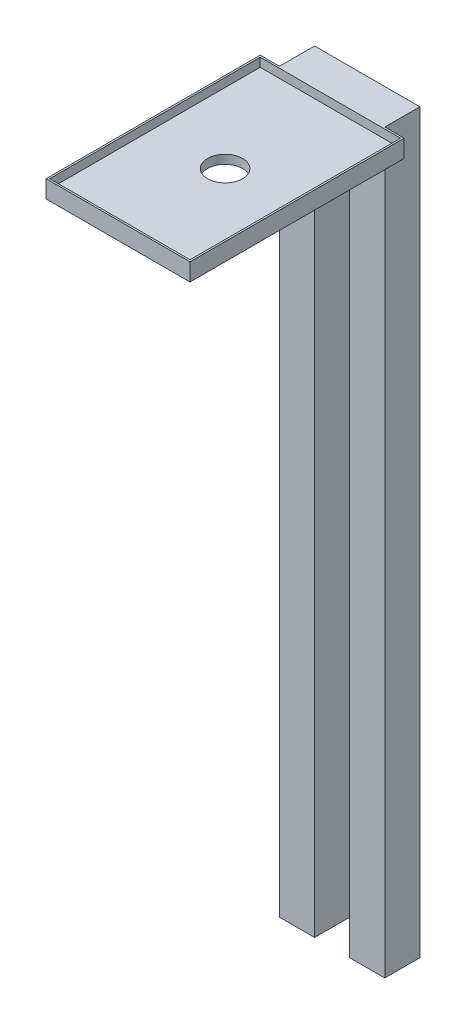
ISO-10303-21;
HEADER;
FILE_DESCRIPTION(('STEP AP214'),'2;1');
FILE_NAME('part.step','',(''),(''),'','','');
FILE_SCHEMA(('AUTOMOTIVE_DESIGN { 1 0 10303 214 1 1 1 1 }'));
ENDSEC;
DATA;
#1=APPLICATION_CONTEXT('core data for automotive mechanical design processes');
#2=APPLICATION_PROTOCOL_DEFINITION('international standard','automotive_design',2000,#1);
#3=PRODUCT_CONTEXT('',#1,'mechanical');
#4=PRODUCT('Part','Part','',(#3));
#5=PRODUCT_RELATED_PRODUCT_CATEGORY('part','',(#4));
#6=PRODUCT_DEFINITION_FORMATION('','',#4);
#7=PRODUCT_DEFINITION_CONTEXT('part definition',#1,'design');
#8=PRODUCT_DEFINITION('design','',#6,#7);
#9=PRODUCT_DEFINITION_SHAPE('','',#8);
#10=(LENGTH_UNIT() NAMED_UNIT(*) SI_UNIT(.MILLI.,.METRE.));
#11=(NAMED_UNIT(*) PLANE_ANGLE_UNIT() SI_UNIT($,.RADIAN.));
#12=(NAMED_UNIT(*) SI_UNIT($,.STERADIAN.) SOLID_ANGLE_UNIT());
#13=UNCERTAINTY_MEASURE_WITH_UNIT(LENGTH_MEASURE(1.E-05),#10,'distance_accuracy_value','');
#14=(GEOMETRIC_REPRESENTATION_CONTEXT(3) GLOBAL_UNCERTAINTY_ASSIGNED_CONTEXT((#13)) GLOBAL_UNIT_ASSIGNED_CONTEXT((#10,
#11,#12)) REPRESENTATION_CONTEXT('',''));
#15=CARTESIAN_POINT('',(0.,0.,0.));
#16=DIRECTION('',(0.,0.,1.));
#17=DIRECTION('',(1.,0.,0.));
#18=AXIS2_PLACEMENT_3D('',#15,#16,#17);
#19=CARTESIAN_POINT('',(15.,-5.,-40.5));
#20=DIRECTION('',(0.,1.,0.));
#21=DIRECTION('',(0.,0.,1.));
#22=AXIS2_PLACEMENT_3D('',#19,#20,#21);
#23=PLANE('',#22);
#24=DIRECTION('',(0.,0.,1.));
#25=VECTOR('',#24,1.);
#26=CARTESIAN_POINT('',(-5.,-5.,-30.5));
#27=LINE('',#26,#25);
#28=CARTESIAN_POINT('',(-5.,-5.,-40.5));
#29=VERTEX_POINT('',#28);
#30=CARTESIAN_POINT('',(-5.,-5.,-30.5));
#31=VERTEX_POINT('',#30);
#32=EDGE_CURVE('E61',#29,#31,#27,.T.);
#33=ORIENTED_EDGE('',*,*,#32,.F.);
#34=DIRECTION('',(-1.,0.,0.));
#35=VECTOR('',#34,1.);
#36=CARTESIAN_POINT('',(15.,-5.,-40.5));
#37=LINE('',#36,#35);
#38=CARTESIAN_POINT('',(5.,-5.,-40.5));
#39=VERTEX_POINT('',#38);
#40=EDGE_CURVE('E225',#39,#29,#37,.T.);
#41=ORIENTED_EDGE('',*,*,#40,.F.);
#42=DIRECTION('',(0.,0.,-1.));
#43=VECTOR('',#42,1.);
#44=CARTESIAN_POINT('',(5.,-5.,-30.5));
#45=LINE('',#44,#43);
#46=CARTESIAN_POINT('',(5.,-5.,-30.5));
#47=VERTEX_POINT('',#46);
#48=EDGE_CURVE('E68',#47,#39,#45,.T.);
#49=ORIENTED_EDGE('',*,*,#48,.F.);
#50=DIRECTION('',(-1.,0.,0.));
#51=VECTOR('',#50,1.);
#52=CARTESIAN_POINT('',(15.,-5.,-30.5));
#53=LINE('',#52,#51);
#54=EDGE_CURVE('E179',#47,#31,#53,.T.);
#55=ORIENTED_EDGE('',*,*,#54,.T.);
#56=EDGE_LOOP('',(#33,#41,#49,#55));
#57=FACE_BOUND('',#56,.T.);
#58=ADVANCED_FACE('F50',(#57),#23,.F.);
#59=CARTESIAN_POINT('',(-20.5,5.,-30.5));
#60=DIRECTION('',(0.,0.,-1.));
#61=DIRECTION('',(-1.,0.,0.));
#62=AXIS2_PLACEMENT_3D('',#59,#60,#61);
#63=PLANE('',#62);
#64=DIRECTION('',(0.,1.,0.));
#65=VECTOR('',#64,1.);
#66=CARTESIAN_POINT('',(-15.,5.,-30.5));
#67=LINE('',#66,#65);
#68=CARTESIAN_POINT('',(-15.,0.,-30.5));
#69=VERTEX_POINT('',#68);
#70=CARTESIAN_POINT('',(-15.,5.,-30.5));
#71=VERTEX_POINT('',#70);
#72=EDGE_CURVE('E11',#69,#71,#67,.T.);
#73=ORIENTED_EDGE('',*,*,#72,.F.);
#74=DIRECTION('',(1.,0.,0.));
#75=VECTOR('',#74,1.);
#76=CARTESIAN_POINT('',(-20.5,0.,-30.5));
#77=LINE('',#76,#75);
#78=CARTESIAN_POINT('',(-20.5,0.,-30.5));
#79=VERTEX_POINT('',#78);
#80=EDGE_CURVE('E269',#79,#69,#77,.T.);
#81=ORIENTED_EDGE('',*,*,#80,.F.);
#82=DIRECTION('',(0.,-1.,0.));
#83=VECTOR('',#82,1.);
#84=CARTESIAN_POINT('',(-20.5,5.,-30.5));
#85=LINE('',#84,#83);
#86=CARTESIAN_POINT('',(-20.5,5.,-30.5));
#87=VERTEX_POINT('',#86);
#88=EDGE_CURVE('E284',#87,#79,#85,.T.);
#89=ORIENTED_EDGE('',*,*,#88,.F.);
#90=DIRECTION('',(1.,0.,0.));
#91=VECTOR('',#90,1.);
#92=CARTESIAN_POINT('',(-20.5,5.,-30.5));
#93=LINE('',#92,#91);
#94=EDGE_CURVE('E260',#87,#71,#93,.T.);
#95=ORIENTED_EDGE('',*,*,#94,.T.);
#96=EDGE_LOOP('',(#73,#81,#89,#95));
#97=FACE_BOUND('',#96,.T.);
#98=ADVANCED_FACE('F337',(#97),#63,.T.);
#99=CARTESIAN_POINT('',(0.,2.5,0.));
#100=DIRECTION('',(0.,1.,0.));
#101=DIRECTION('',(0.,0.,1.));
#102=AXIS2_PLACEMENT_3D('',#99,#100,#101);
#103=PLANE('',#102);
#104=DIRECTION('',(0.,0.,-1.));
#105=VECTOR('',#104,1.);
#106=CARTESIAN_POINT('',(20.,2.5,-30.));
#107=LINE('',#106,#105);
#108=CARTESIAN_POINT('',(20.,2.5,30.));
#109=VERTEX_POINT('',#108);
#110=CARTESIAN_POINT('',(20.,2.5,-30.));
#111=VERTEX_POINT('',#110);
#112=EDGE_CURVE('E293',#109,#111,#107,.T.);
#113=ORIENTED_EDGE('',*,*,#112,.T.);
#114=DIRECTION('',(-1.,0.,0.));
#115=VECTOR('',#114,1.);
#116=CARTESIAN_POINT('',(-20.,2.5,-30.));
#117=LINE('',#116,#115);
#118=CARTESIAN_POINT('',(-20.,2.5,-30.));
#119=VERTEX_POINT('',#118);
#120=EDGE_CURVE('E298',#111,#119,#117,.T.);
#121=ORIENTED_EDGE('',*,*,#120,.T.);
#122=DIRECTION('',(0.,0.,1.));
#123=VECTOR('',#122,1.);
#124=CARTESIAN_POINT('',(-20.,2.5,-30.));
#125=LINE('',#124,#123);
#126=CARTESIAN_POINT('',(-20.,2.5,30.));
#127=VERTEX_POINT('',#126);
#128=EDGE_CURVE('E302',#119,#127,#125,.T.);
#129=ORIENTED_EDGE('',*,*,#128,.T.);
#130=DIRECTION('',(1.,0.,0.));
#131=VECTOR('',#130,1.);
#132=CARTESIAN_POINT('',(-20.,2.5,30.));
#133=LINE('',#132,#131);
#134=EDGE_CURVE('E51',#127,#109,#133,.T.);
#135=ORIENTED_EDGE('',*,*,#134,.T.);
#136=EDGE_LOOP('',(#113,#121,#129,#135));
#137=FACE_BOUND('',#136,.T.);
#138=CARTESIAN_POINT('',(0.,2.5,0.));
#139=DIRECTION('',(0.,1.,0.));
#140=DIRECTION('',(0.,0.,1.));
#141=AXIS2_PLACEMENT_3D('',#138,#139,#140);
#142=CIRCLE('',#141,5.);
#143=CARTESIAN_POINT('',(0.,2.5,5.));
#144=VERTEX_POINT('',#143);
#145=EDGE_CURVE('E295',#144,#144,#142,.T.);
#146=ORIENTED_EDGE('',*,*,#145,.F.);
#147=EDGE_LOOP('',(#146));
#148=FACE_BOUND('',#147,.T.);
#149=ADVANCED_FACE('F308',(#137,#148),#103,.T.);
#150=CARTESIAN_POINT('',(0.,0.,0.));
#151=DIRECTION('',(0.,1.,0.));
#152=DIRECTION('',(0.,0.,1.));
#153=AXIS2_PLACEMENT_3D('',#150,#151,#152);
#154=PLANE('',#153);
#155=CARTESIAN_POINT('',(0.,0.,0.));
#156=DIRECTION('',(0.,1.,0.));
#157=DIRECTION('',(0.,0.,1.));
#158=AXIS2_PLACEMENT_3D('',#155,#156,#157);
#159=CIRCLE('',#158,5.);
#160=CARTESIAN_POINT('',(0.,0.,5.));
#161=VERTEX_POINT('',#160);
#162=EDGE_CURVE('E283',#161,#161,#159,.T.);
#163=ORIENTED_EDGE('',*,*,#162,.T.);
#164=EDGE_LOOP('',(#163));
#165=FACE_BOUND('',#164,.T.);
#166=ORIENTED_EDGE('',*,*,#80,.T.);
#167=CARTESIAN_POINT('',(15.,0.,-30.5));
#168=VERTEX_POINT('',#167);
#169=EDGE_CURVE('E273',#69,#168,#77,.T.);
#170=ORIENTED_EDGE('',*,*,#169,.T.);
#171=CARTESIAN_POINT('',(20.5,0.,-30.5));
#172=VERTEX_POINT('',#171);
#173=EDGE_CURVE('E248',#168,#172,#77,.T.);
#174=ORIENTED_EDGE('',*,*,#173,.T.);
#175=DIRECTION('',(0.,0.,1.));
#176=VECTOR('',#175,1.);
#177=CARTESIAN_POINT('',(20.5,0.,-30.5));
#178=LINE('',#177,#176);
#179=CARTESIAN_POINT('',(20.5,0.,30.5));
#180=VERTEX_POINT('',#179);
#181=EDGE_CURVE('E272',#172,#180,#178,.T.);
#182=ORIENTED_EDGE('',*,*,#181,.T.);
#183=DIRECTION('',(-1.,0.,0.));
#184=VECTOR('',#183,1.);
#185=CARTESIAN_POINT('',(20.5,0.,30.5));
#186=LINE('',#185,#184);
#187=CARTESIAN_POINT('',(-20.5,0.,30.5));
#188=VERTEX_POINT('',#187);
#189=EDGE_CURVE('E280',#180,#188,#186,.T.);
#190=ORIENTED_EDGE('',*,*,#189,.T.);
#191=DIRECTION('',(0.,0.,-1.));
#192=VECTOR('',#191,1.);
#193=CARTESIAN_POINT('',(-20.5,0.,30.5));
#194=LINE('',#193,#192);
#195=EDGE_CURVE('E278',#188,#79,#194,.T.);
#196=ORIENTED_EDGE('',*,*,#195,.T.);
#197=EDGE_LOOP('',(#166,#170,#174,#182,#190,#196));
#198=FACE_BOUND('',#197,.T.);
#199=ADVANCED_FACE('F47',(#165,#198),#154,.F.);
#200=CARTESIAN_POINT('',(0.,2.5,0.));
#201=DIRECTION('',(0.,-1.,0.));
#202=DIRECTION('',(0.,0.,-1.));
#203=AXIS2_PLACEMENT_3D('',#200,#201,#202);
#204=CYLINDRICAL_SURFACE('',#203,5.);
#205=ORIENTED_EDGE('',*,*,#145,.T.);
#206=EDGE_LOOP('',(#205));
#207=FACE_BOUND('',#206,.T.);
#208=ORIENTED_EDGE('',*,*,#162,.F.);
#209=EDGE_LOOP('',(#208));
#210=FACE_BOUND('',#209,.T.);
#211=ADVANCED_FACE('F374',(#207,#210),#204,.F.);
#212=DIRECTION('',(0.,-1.,0.));
#213=VECTOR('',#212,1.);
#214=CARTESIAN_POINT('',(15.,5.,-30.5));
#215=LINE('',#214,#213);
#216=CARTESIAN_POINT('',(15.,5.,-30.5));
#217=VERTEX_POINT('',#216);
#218=EDGE_CURVE('E227',#217,#168,#215,.T.);
#219=ORIENTED_EDGE('',*,*,#218,.F.);
#220=CARTESIAN_POINT('',(20.5,5.,-30.5));
#221=VERTEX_POINT('',#220);
#222=EDGE_CURVE('E257',#217,#221,#93,.T.);
#223=ORIENTED_EDGE('',*,*,#222,.T.);
#224=DIRECTION('',(0.,-1.,0.));
#225=VECTOR('',#224,1.);
#226=CARTESIAN_POINT('',(20.5,5.,-30.5));
#227=LINE('',#226,#225);
#228=EDGE_CURVE('E267',#221,#172,#227,.T.);
#229=ORIENTED_EDGE('',*,*,#228,.T.);
#230=ORIENTED_EDGE('',*,*,#173,.F.);
#231=EDGE_LOOP('',(#219,#223,#229,#230));
#232=FACE_BOUND('',#231,.T.);
#233=ADVANCED_FACE('F343',(#232),#63,.T.);
#234=CARTESIAN_POINT('',(-20.5,5.,30.5));
#235=DIRECTION('',(-1.,0.,0.));
#236=DIRECTION('',(0.,0.,1.));
#237=AXIS2_PLACEMENT_3D('',#234,#235,#236);
#238=PLANE('',#237);
#239=ORIENTED_EDGE('',*,*,#195,.F.);
#240=DIRECTION('',(0.,-1.,0.));
#241=VECTOR('',#240,1.);
#242=CARTESIAN_POINT('',(-20.5,5.,30.5));
#243=LINE('',#242,#241);
#244=CARTESIAN_POINT('',(-20.5,5.,30.5));
#245=VERTEX_POINT('',#244);
#246=EDGE_CURVE('E286',#245,#188,#243,.T.);
#247=ORIENTED_EDGE('',*,*,#246,.F.);
#248=DIRECTION('',(0.,0.,-1.));
#249=VECTOR('',#248,1.);
#250=CARTESIAN_POINT('',(-20.5,5.,30.5));
#251=LINE('',#250,#249);
#252=EDGE_CURVE('E266',#245,#87,#251,.T.);
#253=ORIENTED_EDGE('',*,*,#252,.T.);
#254=ORIENTED_EDGE('',*,*,#88,.T.);
#255=EDGE_LOOP('',(#239,#247,#253,#254));
#256=FACE_BOUND('',#255,.T.);
#257=ADVANCED_FACE('F390',(#256),#238,.T.);
#258=CARTESIAN_POINT('',(20.5,5.,30.5));
#259=DIRECTION('',(0.,0.,1.));
#260=DIRECTION('',(1.,0.,0.));
#261=AXIS2_PLACEMENT_3D('',#258,#259,#260);
#262=PLANE('',#261);
#263=ORIENTED_EDGE('',*,*,#189,.F.);
#264=DIRECTION('',(0.,-1.,0.));
#265=VECTOR('',#264,1.);
#266=CARTESIAN_POINT('',(20.5,5.,30.5));
#267=LINE('',#266,#265);
#268=CARTESIAN_POINT('',(20.5,5.,30.5));
#269=VERTEX_POINT('',#268);
#270=EDGE_CURVE('E289',#269,#180,#267,.T.);
#271=ORIENTED_EDGE('',*,*,#270,.F.);
#272=DIRECTION('',(-1.,0.,0.));
#273=VECTOR('',#272,1.);
#274=CARTESIAN_POINT('',(20.5,5.,30.5));
#275=LINE('',#274,#273);
#276=EDGE_CURVE('E263',#269,#245,#275,.T.);
#277=ORIENTED_EDGE('',*,*,#276,.T.);
#278=ORIENTED_EDGE('',*,*,#246,.T.);
#279=EDGE_LOOP('',(#263,#271,#277,#278));
#280=FACE_BOUND('',#279,.T.);
#281=ADVANCED_FACE('F526',(#280),#262,.T.);
#282=CARTESIAN_POINT('',(20.5,5.,-30.5));
#283=DIRECTION('',(1.,0.,0.));
#284=DIRECTION('',(0.,0.,-1.));
#285=AXIS2_PLACEMENT_3D('',#282,#283,#284);
#286=PLANE('',#285);
#287=ORIENTED_EDGE('',*,*,#181,.F.);
#288=ORIENTED_EDGE('',*,*,#228,.F.);
#289=DIRECTION('',(0.,0.,1.));
#290=VECTOR('',#289,1.);
#291=CARTESIAN_POINT('',(20.5,5.,-30.5));
#292=LINE('',#291,#290);
#293=EDGE_CURVE('E259',#221,#269,#292,.T.);
#294=ORIENTED_EDGE('',*,*,#293,.T.);
#295=ORIENTED_EDGE('',*,*,#270,.T.);
#296=EDGE_LOOP('',(#287,#288,#294,#295));
#297=FACE_BOUND('',#296,.T.);
#298=ADVANCED_FACE('F335',(#297),#286,.T.);
#299=CARTESIAN_POINT('',(0.,5.,0.));
#300=DIRECTION('',(0.,-1.,0.));
#301=DIRECTION('',(0.,0.,-1.));
#302=AXIS2_PLACEMENT_3D('',#299,#300,#301);
#303=PLANE('',#302);
#304=DIRECTION('',(0.,0.,-1.));
#305=VECTOR('',#304,1.);
#306=CARTESIAN_POINT('',(-20.,5.,30.));
#307=LINE('',#306,#305);
#308=CARTESIAN_POINT('',(-20.,5.,30.));
#309=VERTEX_POINT('',#308);
#310=CARTESIAN_POINT('',(-20.,5.,-30.));
#311=VERTEX_POINT('',#310);
#312=EDGE_CURVE('E245',#309,#311,#307,.T.);
#313=ORIENTED_EDGE('',*,*,#312,.T.);
#314=DIRECTION('',(1.,0.,0.));
#315=VECTOR('',#314,1.);
#316=CARTESIAN_POINT('',(-20.,5.,-30.));
#317=LINE('',#316,#315);
#318=CARTESIAN_POINT('',(20.,5.,-30.));
#319=VERTEX_POINT('',#318);
#320=EDGE_CURVE('E234',#311,#319,#317,.T.);
#321=ORIENTED_EDGE('',*,*,#320,.T.);
#322=DIRECTION('',(0.,0.,1.));
#323=VECTOR('',#322,1.);
#324=CARTESIAN_POINT('',(20.,5.,-30.));
#325=LINE('',#324,#323);
#326=CARTESIAN_POINT('',(20.,5.,30.));
#327=VERTEX_POINT('',#326);
#328=EDGE_CURVE('E237',#319,#327,#325,.T.);
#329=ORIENTED_EDGE('',*,*,#328,.T.);
#330=DIRECTION('',(-1.,0.,0.));
#331=VECTOR('',#330,1.);
#332=CARTESIAN_POINT('',(20.,5.,30.));
#333=LINE('',#332,#331);
#334=EDGE_CURVE('E239',#327,#309,#333,.T.);
#335=ORIENTED_EDGE('',*,*,#334,.T.);
#336=EDGE_LOOP('',(#313,#321,#329,#335));
#337=FACE_BOUND('',#336,.T.);
#338=ORIENTED_EDGE('',*,*,#94,.F.);
#339=ORIENTED_EDGE('',*,*,#252,.F.);
#340=ORIENTED_EDGE('',*,*,#276,.F.);
#341=ORIENTED_EDGE('',*,*,#293,.F.);
#342=ORIENTED_EDGE('',*,*,#222,.F.);
#343=DIRECTION('',(0.,0.,1.));
#344=VECTOR('',#343,1.);
#345=CARTESIAN_POINT('',(15.,5.,-40.5));
#346=LINE('',#345,#344);
#347=CARTESIAN_POINT('',(15.,5.,-40.5));
#348=VERTEX_POINT('',#347);
#349=EDGE_CURVE('E224',#348,#217,#346,.T.);
#350=ORIENTED_EDGE('',*,*,#349,.F.);
#351=DIRECTION('',(1.,0.,0.));
#352=VECTOR('',#351,1.);
#353=CARTESIAN_POINT('',(15.,5.,-40.5));
#354=LINE('',#353,#352);
#355=CARTESIAN_POINT('',(-15.,5.,-40.5));
#356=VERTEX_POINT('',#355);
#357=EDGE_CURVE('E177',#356,#348,#354,.T.);
#358=ORIENTED_EDGE('',*,*,#357,.F.);
#359=DIRECTION('',(0.,0.,1.));
#360=VECTOR('',#359,1.);
#361=CARTESIAN_POINT('',(-15.,5.,-40.5));
#362=LINE('',#361,#360);
#363=EDGE_CURVE('E173',#356,#71,#362,.T.);
#364=ORIENTED_EDGE('',*,*,#363,.T.);
#365=EDGE_LOOP('',(#338,#339,#340,#341,#342,#350,#358,#364));
#366=FACE_BOUND('',#365,.T.);
#367=ADVANCED_FACE('F320',(#337,#366),#303,.F.);
#368=CARTESIAN_POINT('',(-20.,5.,-30.));
#369=DIRECTION('',(0.,0.,-1.));
#370=DIRECTION('',(-1.,0.,0.));
#371=AXIS2_PLACEMENT_3D('',#368,#369,#370);
#372=PLANE('',#371);
#373=ORIENTED_EDGE('',*,*,#120,.F.);
#374=DIRECTION('',(0.,-1.,0.));
#375=VECTOR('',#374,1.);
#376=CARTESIAN_POINT('',(20.,5.,-30.));
#377=LINE('',#376,#375);
#378=EDGE_CURVE('E243',#319,#111,#377,.T.);
#379=ORIENTED_EDGE('',*,*,#378,.F.);
#380=ORIENTED_EDGE('',*,*,#320,.F.);
#381=DIRECTION('',(0.,-1.,0.));
#382=VECTOR('',#381,1.);
#383=CARTESIAN_POINT('',(-20.,5.,-30.));
#384=LINE('',#383,#382);
#385=EDGE_CURVE('E246',#311,#119,#384,.T.);
#386=ORIENTED_EDGE('',*,*,#385,.T.);
#387=EDGE_LOOP('',(#373,#379,#380,#386));
#388=FACE_BOUND('',#387,.T.);
#389=ADVANCED_FACE('F323',(#388),#372,.F.);
#390=CARTESIAN_POINT('',(-20.,5.,30.));
#391=DIRECTION('',(-1.,0.,0.));
#392=DIRECTION('',(0.,0.,1.));
#393=AXIS2_PLACEMENT_3D('',#390,#391,#392);
#394=PLANE('',#393);
#395=ORIENTED_EDGE('',*,*,#128,.F.);
#396=ORIENTED_EDGE('',*,*,#385,.F.);
#397=ORIENTED_EDGE('',*,*,#312,.F.);
#398=DIRECTION('',(0.,-1.,0.));
#399=VECTOR('',#398,1.);
#400=CARTESIAN_POINT('',(-20.,5.,30.));
#401=LINE('',#400,#399);
#402=EDGE_CURVE('E250',#309,#127,#401,.T.);
#403=ORIENTED_EDGE('',*,*,#402,.T.);
#404=EDGE_LOOP('',(#395,#396,#397,#403));
#405=FACE_BOUND('',#404,.T.);
#406=ADVANCED_FACE('F314',(#405),#394,.F.);
#407=CARTESIAN_POINT('',(20.,5.,30.));
#408=DIRECTION('',(0.,0.,1.));
#409=DIRECTION('',(1.,0.,0.));
#410=AXIS2_PLACEMENT_3D('',#407,#408,#409);
#411=PLANE('',#410);
#412=ORIENTED_EDGE('',*,*,#134,.F.);
#413=ORIENTED_EDGE('',*,*,#402,.F.);
#414=ORIENTED_EDGE('',*,*,#334,.F.);
#415=DIRECTION('',(0.,-1.,0.));
#416=VECTOR('',#415,1.);
#417=CARTESIAN_POINT('',(20.,5.,30.));
#418=LINE('',#417,#416);
#419=EDGE_CURVE('E251',#327,#109,#418,.T.);
#420=ORIENTED_EDGE('',*,*,#419,.T.);
#421=EDGE_LOOP('',(#412,#413,#414,#420));
#422=FACE_BOUND('',#421,.T.);
#423=ADVANCED_FACE('F309',(#422),#411,.F.);
#424=CARTESIAN_POINT('',(20.,5.,-30.));
#425=DIRECTION('',(1.,0.,0.));
#426=DIRECTION('',(0.,0.,-1.));
#427=AXIS2_PLACEMENT_3D('',#424,#425,#426);
#428=PLANE('',#427);
#429=ORIENTED_EDGE('',*,*,#112,.F.);
#430=ORIENTED_EDGE('',*,*,#419,.F.);
#431=ORIENTED_EDGE('',*,*,#328,.F.);
#432=ORIENTED_EDGE('',*,*,#378,.T.);
#433=EDGE_LOOP('',(#429,#430,#431,#432));
#434=FACE_BOUND('',#433,.T.);
#435=ADVANCED_FACE('F321',(#434),#428,.F.);
#436=CARTESIAN_POINT('',(-15.,5.,-40.5));
#437=DIRECTION('',(1.,0.,0.));
#438=DIRECTION('',(0.,0.,-1.));
#439=AXIS2_PLACEMENT_3D('',#436,#437,#438);
#440=PLANE('',#439);
#441=CARTESIAN_POINT('',(-15.,-205.,-30.5));
#442=VERTEX_POINT('',#441);
#443=EDGE_CURVE('E60',#442,#69,#67,.T.);
#444=ORIENTED_EDGE('',*,*,#443,.T.);
#445=ORIENTED_EDGE('',*,*,#72,.T.);
#446=ORIENTED_EDGE('',*,*,#363,.F.);
#447=DIRECTION('',(0.,1.,0.));
#448=VECTOR('',#447,1.);
#449=CARTESIAN_POINT('',(-15.,5.,-40.5));
#450=LINE('',#449,#448);
#451=CARTESIAN_POINT('',(-15.,-205.,-40.5));
#452=VERTEX_POINT('',#451);
#453=EDGE_CURVE('E169',#452,#356,#450,.T.);
#454=ORIENTED_EDGE('',*,*,#453,.F.);
#455=DIRECTION('',(0.,0.,-1.));
#456=VECTOR('',#455,1.);
#457=CARTESIAN_POINT('',(-15.,-205.,-30.5));
#458=LINE('',#457,#456);
#459=EDGE_CURVE('E174',#442,#452,#458,.T.);
#460=ORIENTED_EDGE('',*,*,#459,.F.);
#461=EDGE_LOOP('',(#444,#445,#446,#454,#460));
#462=FACE_BOUND('',#461,.T.);
#463=ADVANCED_FACE('F172',(#462),#440,.F.);
#464=CARTESIAN_POINT('',(15.,5.,-40.5));
#465=DIRECTION('',(-1.,0.,0.));
#466=DIRECTION('',(0.,0.,1.));
#467=AXIS2_PLACEMENT_3D('',#464,#465,#466);
#468=PLANE('',#467);
#469=ORIENTED_EDGE('',*,*,#218,.T.);
#470=CARTESIAN_POINT('',(15.,-205.,-30.5));
#471=VERTEX_POINT('',#470);
#472=EDGE_CURVE('E223',#168,#471,#215,.T.);
#473=ORIENTED_EDGE('',*,*,#472,.T.);
#474=DIRECTION('',(0.,0.,1.));
#475=VECTOR('',#474,1.);
#476=CARTESIAN_POINT('',(15.,-205.,-30.5));
#477=LINE('',#476,#475);
#478=CARTESIAN_POINT('',(15.,-205.,-40.5));
#479=VERTEX_POINT('',#478);
#480=EDGE_CURVE('E209',#479,#471,#477,.T.);
#481=ORIENTED_EDGE('',*,*,#480,.F.);
#482=DIRECTION('',(0.,-1.,0.));
#483=VECTOR('',#482,1.);
#484=CARTESIAN_POINT('',(15.,5.,-40.5));
#485=LINE('',#484,#483);
#486=EDGE_CURVE('E219',#348,#479,#485,.T.);
#487=ORIENTED_EDGE('',*,*,#486,.F.);
#488=ORIENTED_EDGE('',*,*,#349,.T.);
#489=EDGE_LOOP('',(#469,#473,#481,#487,#488));
#490=FACE_BOUND('',#489,.T.);
#491=ADVANCED_FACE('F349',(#490),#468,.F.);
#492=CARTESIAN_POINT('',(0.,0.,-40.5));
#493=DIRECTION('',(0.,0.,-1.));
#494=DIRECTION('',(-1.,0.,0.));
#495=AXIS2_PLACEMENT_3D('',#492,#493,#494);
#496=PLANE('',#495);
#497=ORIENTED_EDGE('',*,*,#453,.T.);
#498=ORIENTED_EDGE('',*,*,#357,.T.);
#499=ORIENTED_EDGE('',*,*,#486,.T.);
#500=DIRECTION('',(1.,0.,0.));
#501=VECTOR('',#500,1.);
#502=CARTESIAN_POINT('',(15.,-205.,-40.5));
#503=LINE('',#502,#501);
#504=CARTESIAN_POINT('',(5.,-205.,-40.5));
#505=VERTEX_POINT('',#504);
#506=EDGE_CURVE('E208',#505,#479,#503,.T.);
#507=ORIENTED_EDGE('',*,*,#506,.F.);
#508=DIRECTION('',(0.,1.,0.));
#509=VECTOR('',#508,1.);
#510=CARTESIAN_POINT('',(5.,-205.,-40.5));
#511=LINE('',#510,#509);
#512=EDGE_CURVE('E202',#505,#39,#511,.T.);
#513=ORIENTED_EDGE('',*,*,#512,.T.);
#514=ORIENTED_EDGE('',*,*,#40,.T.);
#515=DIRECTION('',(0.,1.,0.));
#516=VECTOR('',#515,1.);
#517=CARTESIAN_POINT('',(-5.,-205.,-40.5));
#518=LINE('',#517,#516);
#519=CARTESIAN_POINT('',(-5.,-205.,-40.5));
#520=VERTEX_POINT('',#519);
#521=EDGE_CURVE('E184',#520,#29,#518,.T.);
#522=ORIENTED_EDGE('',*,*,#521,.F.);
#523=DIRECTION('',(1.,0.,0.));
#524=VECTOR('',#523,1.);
#525=CARTESIAN_POINT('',(-15.,-205.,-40.5));
#526=LINE('',#525,#524);
#527=EDGE_CURVE('E182',#452,#520,#526,.T.);
#528=ORIENTED_EDGE('',*,*,#527,.F.);
#529=EDGE_LOOP('',(#497,#498,#499,#507,#513,#514,#522,#528));
#530=FACE_BOUND('',#529,.T.);
#531=ADVANCED_FACE('F185',(#530),#496,.T.);
#532=CARTESIAN_POINT('',(0.,0.,-30.5));
#533=DIRECTION('',(0.,0.,-1.));
#534=DIRECTION('',(-1.,0.,0.));
#535=AXIS2_PLACEMENT_3D('',#532,#533,#534);
#536=PLANE('',#535);
#537=ORIENTED_EDGE('',*,*,#169,.F.);
#538=ORIENTED_EDGE('',*,*,#443,.F.);
#539=DIRECTION('',(-1.,0.,0.));
#540=VECTOR('',#539,1.);
#541=CARTESIAN_POINT('',(-15.,-205.,-30.5));
#542=LINE('',#541,#540);
#543=CARTESIAN_POINT('',(-5.,-205.,-30.5));
#544=VERTEX_POINT('',#543);
#545=EDGE_CURVE('E192',#544,#442,#542,.T.);
#546=ORIENTED_EDGE('',*,*,#545,.F.);
#547=DIRECTION('',(0.,1.,0.));
#548=VECTOR('',#547,1.);
#549=CARTESIAN_POINT('',(-5.,-205.,-30.5));
#550=LINE('',#549,#548);
#551=EDGE_CURVE('E197',#544,#31,#550,.T.);
#552=ORIENTED_EDGE('',*,*,#551,.T.);
#553=ORIENTED_EDGE('',*,*,#54,.F.);
#554=DIRECTION('',(0.,1.,0.));
#555=VECTOR('',#554,1.);
#556=CARTESIAN_POINT('',(5.,-205.,-30.5));
#557=LINE('',#556,#555);
#558=CARTESIAN_POINT('',(5.,-205.,-30.5));
#559=VERTEX_POINT('',#558);
#560=EDGE_CURVE('E205',#559,#47,#557,.T.);
#561=ORIENTED_EDGE('',*,*,#560,.F.);
#562=DIRECTION('',(-1.,0.,0.));
#563=VECTOR('',#562,1.);
#564=CARTESIAN_POINT('',(15.,-205.,-30.5));
#565=LINE('',#564,#563);
#566=EDGE_CURVE('E214',#471,#559,#565,.T.);
#567=ORIENTED_EDGE('',*,*,#566,.F.);
#568=ORIENTED_EDGE('',*,*,#472,.F.);
#569=EDGE_LOOP('',(#537,#538,#546,#552,#553,#561,#567,#568));
#570=FACE_BOUND('',#569,.T.);
#571=ADVANCED_FACE('F350',(#570),#536,.F.);
#572=CARTESIAN_POINT('',(5.,-205.,-30.5));
#573=DIRECTION('',(1.,0.,0.));
#574=DIRECTION('',(0.,0.,-1.));
#575=AXIS2_PLACEMENT_3D('',#572,#573,#574);
#576=PLANE('',#575);
#577=ORIENTED_EDGE('',*,*,#48,.T.);
#578=ORIENTED_EDGE('',*,*,#512,.F.);
#579=DIRECTION('',(0.,0.,-1.));
#580=VECTOR('',#579,1.);
#581=CARTESIAN_POINT('',(5.,-205.,-30.5));
#582=LINE('',#581,#580);
#583=EDGE_CURVE('E213',#559,#505,#582,.T.);
#584=ORIENTED_EDGE('',*,*,#583,.F.);
#585=ORIENTED_EDGE('',*,*,#560,.T.);
#586=EDGE_LOOP('',(#577,#578,#584,#585));
#587=FACE_BOUND('',#586,.T.);
#588=ADVANCED_FACE('F439',(#587),#576,.F.);
#589=CARTESIAN_POINT('',(0.,-205.,0.));
#590=DIRECTION('',(0.,1.,0.));
#591=DIRECTION('',(0.,0.,1.));
#592=AXIS2_PLACEMENT_3D('',#589,#590,#591);
#593=PLANE('',#592);
#594=ORIENTED_EDGE('',*,*,#480,.T.);
#595=ORIENTED_EDGE('',*,*,#566,.T.);
#596=ORIENTED_EDGE('',*,*,#583,.T.);
#597=ORIENTED_EDGE('',*,*,#506,.T.);
#598=EDGE_LOOP('',(#594,#595,#596,#597));
#599=FACE_BOUND('',#598,.T.);
#600=ADVANCED_FACE('F449',(#599),#593,.F.);
#601=CARTESIAN_POINT('',(-5.,-205.,-30.5));
#602=DIRECTION('',(-1.,0.,0.));
#603=DIRECTION('',(0.,0.,1.));
#604=AXIS2_PLACEMENT_3D('',#601,#602,#603);
#605=PLANE('',#604);
#606=ORIENTED_EDGE('',*,*,#32,.T.);
#607=ORIENTED_EDGE('',*,*,#551,.F.);
#608=DIRECTION('',(0.,0.,1.));
#609=VECTOR('',#608,1.);
#610=CARTESIAN_POINT('',(-5.,-205.,-30.5));
#611=LINE('',#610,#609);
#612=EDGE_CURVE('E190',#520,#544,#611,.T.);
#613=ORIENTED_EDGE('',*,*,#612,.F.);
#614=ORIENTED_EDGE('',*,*,#521,.T.);
#615=EDGE_LOOP('',(#606,#607,#613,#614));
#616=FACE_BOUND('',#615,.T.);
#617=ADVANCED_FACE('F460',(#616),#605,.F.);
#618=CARTESIAN_POINT('',(0.,-205.,0.));
#619=DIRECTION('',(0.,-1.,0.));
#620=DIRECTION('',(0.,0.,-1.));
#621=AXIS2_PLACEMENT_3D('',#618,#619,#620);
#622=PLANE('',#621);
#623=ORIENTED_EDGE('',*,*,#459,.T.);
#624=ORIENTED_EDGE('',*,*,#527,.T.);
#625=ORIENTED_EDGE('',*,*,#612,.T.);
#626=ORIENTED_EDGE('',*,*,#545,.T.);
#627=EDGE_LOOP('',(#623,#624,#625,#626));
#628=FACE_BOUND('',#627,.T.);
#629=ADVANCED_FACE('F188',(#628),#622,.T.);
#630=CLOSED_SHELL('',(#58,#98,#149,#199,#211,#233,#257,#281,#298,#367,#389,#406,#423,#435,#463,
#491,#531,#571,#588,#600,#617,#629));
#631=MANIFOLD_SOLID_BREP('B2',#630);
#632=ADVANCED_BREP_SHAPE_REPRESENTATION('',(#18,#631),#14);
#633=SHAPE_DEFINITION_REPRESENTATION(#9,#632);
ENDSEC;
END-ISO-10303-21;
